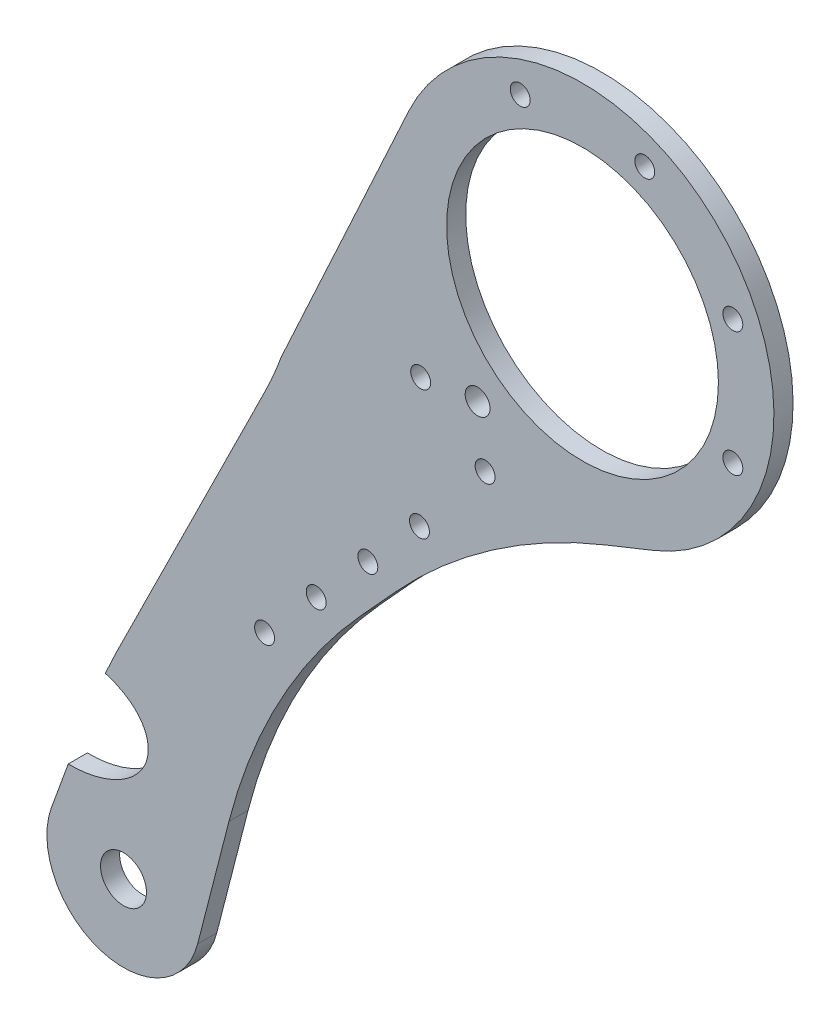
ISO-10303-21;
HEADER;
FILE_DESCRIPTION(('STEP AP214'),'2;1');
FILE_NAME('part.step','',(''),(''),'','','');
FILE_SCHEMA(('AUTOMOTIVE_DESIGN { 1 0 10303 214 1 1 1 1 }'));
ENDSEC;
DATA;
#1=APPLICATION_CONTEXT('core data for automotive mechanical design processes');
#2=APPLICATION_PROTOCOL_DEFINITION('international standard','automotive_design',2000,#1);
#3=PRODUCT_CONTEXT('',#1,'mechanical');
#4=PRODUCT('Part','Part','',(#3));
#5=PRODUCT_RELATED_PRODUCT_CATEGORY('part','',(#4));
#6=PRODUCT_DEFINITION_FORMATION('','',#4);
#7=PRODUCT_DEFINITION_CONTEXT('part definition',#1,'design');
#8=PRODUCT_DEFINITION('design','',#6,#7);
#9=PRODUCT_DEFINITION_SHAPE('','',#8);
#10=(LENGTH_UNIT() NAMED_UNIT(*) SI_UNIT(.MILLI.,.METRE.));
#11=(NAMED_UNIT(*) PLANE_ANGLE_UNIT() SI_UNIT($,.RADIAN.));
#12=(NAMED_UNIT(*) SI_UNIT($,.STERADIAN.) SOLID_ANGLE_UNIT());
#13=UNCERTAINTY_MEASURE_WITH_UNIT(LENGTH_MEASURE(1.E-05),#10,'distance_accuracy_value','');
#14=(GEOMETRIC_REPRESENTATION_CONTEXT(3) GLOBAL_UNCERTAINTY_ASSIGNED_CONTEXT((#13)) GLOBAL_UNIT_ASSIGNED_CONTEXT((#10,
#11,#12)) REPRESENTATION_CONTEXT('',''));
#15=CARTESIAN_POINT('',(0.,0.,0.));
#16=DIRECTION('',(0.,0.,1.));
#17=DIRECTION('',(1.,0.,0.));
#18=AXIS2_PLACEMENT_3D('',#15,#16,#17);
#19=CARTESIAN_POINT('',(-87.2473558230127,-77.9723044074539,5.));
#20=DIRECTION('',(0.,0.,1.));
#21=DIRECTION('',(1.,0.,0.));
#22=AXIS2_PLACEMENT_3D('',#19,#20,#21);
#23=PLANE('',#22);
#24=CARTESIAN_POINT('',(18.3767093876581,44.2943786461941,5.));
#25=DIRECTION('',(0.,0.,1.));
#26=DIRECTION('',(1.,0.,0.));
#27=AXIS2_PLACEMENT_3D('',#24,#25,#26);
#28=CIRCLE('',#27,3.25);
#29=CARTESIAN_POINT('',(21.6267093876581,44.2943786461941,5.));
#30=VERTEX_POINT('',#29);
#31=EDGE_CURVE('E182',#30,#30,#28,.T.);
#32=ORIENTED_EDGE('',*,*,#31,.F.);
#33=EDGE_LOOP('',(#32));
#34=FACE_BOUND('',#33,.T.);
#35=CARTESIAN_POINT('',(29.5069278175342,119.260159091029,5.));
#36=DIRECTION('',(0.,0.,1.));
#37=DIRECTION('',(1.,0.,0.));
#38=AXIS2_PLACEMENT_3D('',#35,#36,#37);
#39=CIRCLE('',#38,2.6);
#40=CARTESIAN_POINT('',(32.1069278175342,119.260159091029,5.));
#41=VERTEX_POINT('',#40);
#42=EDGE_CURVE('E194',#41,#41,#39,.T.);
#43=ORIENTED_EDGE('',*,*,#42,.F.);
#44=EDGE_LOOP('',(#43));
#45=FACE_BOUND('',#44,.T.);
#46=CARTESIAN_POINT('',(62.0350195685669,119.260159091029,5.));
#47=DIRECTION('',(0.,0.,1.));
#48=DIRECTION('',(1.,0.,0.));
#49=AXIS2_PLACEMENT_3D('',#46,#47,#48);
#50=CIRCLE('',#49,2.6);
#51=CARTESIAN_POINT('',(64.6350195685669,119.260159091029,5.));
#52=VERTEX_POINT('',#51);
#53=EDGE_CURVE('E200',#52,#52,#50,.T.);
#54=ORIENTED_EDGE('',*,*,#53,.F.);
#55=EDGE_LOOP('',(#54));
#56=FACE_BOUND('',#55,.T.);
#57=CARTESIAN_POINT('',(85.0358538247802,96.259324834816,5.));
#58=DIRECTION('',(0.,0.,1.));
#59=DIRECTION('',(1.,0.,0.));
#60=AXIS2_PLACEMENT_3D('',#57,#58,#59);
#61=CIRCLE('',#60,2.60000000000002);
#62=CARTESIAN_POINT('',(87.6358538247802,96.259324834816,5.));
#63=VERTEX_POINT('',#62);
#64=EDGE_CURVE('E206',#63,#63,#61,.T.);
#65=ORIENTED_EDGE('',*,*,#64,.F.);
#66=EDGE_LOOP('',(#65));
#67=FACE_BOUND('',#66,.T.);
#68=CARTESIAN_POINT('',(85.0358538247802,63.7312330837833,5.));
#69=DIRECTION('',(0.,0.,1.));
#70=DIRECTION('',(1.,0.,0.));
#71=AXIS2_PLACEMENT_3D('',#68,#69,#70);
#72=CIRCLE('',#71,2.6);
#73=CARTESIAN_POINT('',(87.6358538247802,63.7312330837833,5.));
#74=VERTEX_POINT('',#73);
#75=EDGE_CURVE('E187',#74,#74,#72,.T.);
#76=ORIENTED_EDGE('',*,*,#75,.F.);
#77=EDGE_LOOP('',(#76));
#78=FACE_BOUND('',#77,.T.);
#79=CARTESIAN_POINT('',(-23.7747681862979,-21.0648015144859,5.));
#80=DIRECTION('',(0.,0.,1.));
#81=DIRECTION('',(1.,0.,0.));
#82=AXIS2_PLACEMENT_3D('',#79,#80,#81);
#83=CIRCLE('',#82,2.6);
#84=CARTESIAN_POINT('',(-21.1747681862979,-21.0648015144859,5.));
#85=VERTEX_POINT('',#84);
#86=EDGE_CURVE('E220',#85,#85,#83,.T.);
#87=ORIENTED_EDGE('',*,*,#86,.F.);
#88=EDGE_LOOP('',(#87));
#89=FACE_BOUND('',#88,.T.);
#90=CARTESIAN_POINT('',(-37.2593092551394,-35.8352839765698,5.));
#91=DIRECTION('',(0.,0.,1.));
#92=DIRECTION('',(1.,0.,0.));
#93=AXIS2_PLACEMENT_3D('',#90,#91,#92);
#94=CIRCLE('',#93,2.6);
#95=CARTESIAN_POINT('',(-34.6593092551394,-35.8352839765698,5.));
#96=VERTEX_POINT('',#95);
#97=EDGE_CURVE('E232',#96,#96,#94,.T.);
#98=ORIENTED_EDGE('',*,*,#97,.F.);
#99=EDGE_LOOP('',(#98));
#100=FACE_BOUND('',#99,.T.);
#101=CARTESIAN_POINT('',(3.50503646705098,42.3364857628933,5.));
#102=DIRECTION('',(0.,0.,1.));
#103=DIRECTION('',(1.,0.,0.));
#104=AXIS2_PLACEMENT_3D('',#101,#102,#103);
#105=CIRCLE('',#104,2.6);
#106=CARTESIAN_POINT('',(6.10503646705098,42.3364857628933,5.));
#107=VERTEX_POINT('',#106);
#108=EDGE_CURVE('E238',#107,#107,#105,.T.);
#109=ORIENTED_EDGE('',*,*,#108,.F.);
#110=EDGE_LOOP('',(#109));
#111=FACE_BOUND('',#110,.T.);
#112=CARTESIAN_POINT('',(-74.1078932401975,-109.9952789593,5.));
#113=DIRECTION('',(0.,0.,1.));
#114=DIRECTION('',(1.,0.,0.));
#115=AXIS2_PLACEMENT_3D('',#112,#113,#114);
#116=CIRCLE('',#115,6.00000000000002);
#117=CARTESIAN_POINT('',(-68.1078932401974,-109.9952789593,5.));
#118=VERTEX_POINT('',#117);
#119=EDGE_CURVE('E250',#118,#118,#116,.T.);
#120=ORIENTED_EDGE('',*,*,#119,.F.);
#121=EDGE_LOOP('',(#120));
#122=FACE_BOUND('',#121,.T.);
#123=CARTESIAN_POINT('',(20.3346022709589,29.4227057255869,5.));
#124=DIRECTION('',(0.,0.,1.));
#125=DIRECTION('',(1.,0.,0.));
#126=AXIS2_PLACEMENT_3D('',#123,#124,#125);
#127=CIRCLE('',#126,2.6);
#128=CARTESIAN_POINT('',(22.9346022709589,29.4227057255869,5.));
#129=VERTEX_POINT('',#128);
#130=EDGE_CURVE('E244',#129,#129,#127,.T.);
#131=ORIENTED_EDGE('',*,*,#130,.F.);
#132=EDGE_LOOP('',(#131));
#133=FACE_BOUND('',#132,.T.);
#134=CARTESIAN_POINT('',(-10.2902271174564,-6.294319052402,5.));
#135=DIRECTION('',(0.,0.,1.));
#136=DIRECTION('',(1.,0.,0.));
#137=AXIS2_PLACEMENT_3D('',#134,#135,#136);
#138=CIRCLE('',#137,2.6);
#139=CARTESIAN_POINT('',(-7.69022711745644,-6.294319052402,5.));
#140=VERTEX_POINT('',#139);
#141=EDGE_CURVE('E226',#140,#140,#138,.T.);
#142=ORIENTED_EDGE('',*,*,#141,.F.);
#143=EDGE_LOOP('',(#142));
#144=FACE_BOUND('',#143,.T.);
#145=CARTESIAN_POINT('',(3.19431395138503,8.4761634096819,5.));
#146=DIRECTION('',(0.,0.,1.));
#147=DIRECTION('',(1.,0.,0.));
#148=AXIS2_PLACEMENT_3D('',#145,#146,#147);
#149=CIRCLE('',#148,2.6);
#150=CARTESIAN_POINT('',(5.79431395138502,8.4761634096819,5.));
#151=VERTEX_POINT('',#150);
#152=EDGE_CURVE('E214',#151,#151,#149,.T.);
#153=ORIENTED_EDGE('',*,*,#152,.F.);
#154=EDGE_LOOP('',(#153));
#155=FACE_BOUND('',#154,.T.);
#156=CARTESIAN_POINT('',(-74.1078932401975,-109.9952789593,5.));
#157=DIRECTION('',(0.,0.,1.));
#158=DIRECTION('',(1.,0.,0.));
#159=AXIS2_PLACEMENT_3D('',#156,#157,#158);
#160=CIRCLE('',#159,20.0000000000002);
#161=CARTESIAN_POINT('',(-92.9017456559157,-103.154876092786,5.));
#162=VERTEX_POINT('',#161);
#163=CARTESIAN_POINT('',(-54.7372550512299,-114.973067238457,5.));
#164=VERTEX_POINT('',#163);
#165=EDGE_CURVE('E345',#162,#164,#160,.T.);
#166=ORIENTED_EDGE('',*,*,#165,.T.);
#167=DIRECTION('',(-0.248889413957879,-0.968531909448369,0.));
#168=VECTOR('',#167,1.);
#169=CARTESIAN_POINT('',(-23.6314026287413,6.07270229704667,5.));
#170=LINE('',#169,#168);
#171=CARTESIAN_POINT('',(-46.5614675153302,-83.1576879201177,5.));
#172=VERTEX_POINT('',#171);
#173=EDGE_CURVE('E165',#172,#164,#170,.T.);
#174=ORIENTED_EDGE('',*,*,#173,.F.);
#175=CARTESIAN_POINT('',(98.7183189019252,-120.4911000138,5.));
#176=DIRECTION('',(0.,0.,1.));
#177=DIRECTION('',(1.,0.,0.));
#178=AXIS2_PLACEMENT_3D('',#175,#176,#177);
#179=CIRCLE('',#178,150.);
#180=CARTESIAN_POINT('',(-12.060299563704,-19.3570419974885,5.));
#181=VERTEX_POINT('',#180);
#182=EDGE_CURVE('E57',#172,#181,#179,.F.);
#183=ORIENTED_EDGE('',*,*,#182,.T.);
#184=DIRECTION('',(0.674227053442074,0.738524123104194,0.));
#185=VECTOR('',#184,1.);
#186=CARTESIAN_POINT('',(3.06060587253825,-2.79414472003352,5.));
#187=LINE('',#186,#185);
#188=CARTESIAN_POINT('',(-3.07570514297694,-9.51563963586652,5.));
#189=VERTEX_POINT('',#188);
#190=EDGE_CURVE('E171',#181,#189,#187,.T.);
#191=ORIENTED_EDGE('',*,*,#190,.T.);
#192=CARTESIAN_POINT('',(107.702913322652,-110.649697652178,5.));
#193=DIRECTION('',(0.,0.,1.));
#194=DIRECTION('',(1.,0.,0.));
#195=AXIS2_PLACEMENT_3D('',#192,#193,#194);
#196=CIRCLE('',#195,150.);
#197=CARTESIAN_POINT('',(51.8864623927853,28.5786177351522,5.));
#198=VERTEX_POINT('',#197);
#199=EDGE_CURVE('E170',#189,#198,#196,.F.);
#200=ORIENTED_EDGE('',*,*,#199,.T.);
#201=DIRECTION('',(-0.928188769248865,-0.37210967286578,0.));
#202=VECTOR('',#201,1.);
#203=CARTESIAN_POINT('',(-2.68622157797908,6.70049956291646,5.));
#204=LINE('',#203,#202);
#205=CARTESIAN_POINT('',(64.3764573363395,33.5858404968565,5.));
#206=VERTEX_POINT('',#205);
#207=EDGE_CURVE('E160',#206,#198,#204,.T.);
#208=ORIENTED_EDGE('',*,*,#207,.F.);
#209=CARTESIAN_POINT('',(45.7709736930505,79.9952789592997,5.));
#210=DIRECTION('',(0.,0.,1.));
#211=DIRECTION('',(1.,0.,0.));
#212=AXIS2_PLACEMENT_3D('',#209,#210,#211);
#213=CIRCLE('',#212,50.);
#214=CARTESIAN_POINT('',(0.358293308096093,100.916284199344,5.));
#215=VERTEX_POINT('',#214);
#216=EDGE_CURVE('E144',#206,#215,#213,.T.);
#217=ORIENTED_EDGE('',*,*,#216,.T.);
#218=DIRECTION('',(-0.418420104800895,-0.908253607699088,0.));
#219=VECTOR('',#218,1.);
#220=CARTESIAN_POINT('',(0.358293308096093,100.916284199344,5.));
#221=LINE('',#220,#219);
#222=CARTESIAN_POINT('',(-32.8546222168167,28.8218747730539,5.));
#223=VERTEX_POINT('',#222);
#224=EDGE_CURVE('E153',#215,#223,#221,.T.);
#225=ORIENTED_EDGE('',*,*,#224,.T.);
#226=CARTESIAN_POINT('',(-126.823884295407,63.0238891056213,5.));
#227=DIRECTION('',(0.,0.,-1.));
#228=DIRECTION('',(1.,0.,0.));
#229=AXIS2_PLACEMENT_3D('',#226,#227,#228);
#230=CIRCLE('',#229,100.);
#231=CARTESIAN_POINT('',(-37.2097827502313,18.6469491001312,5.));
#232=VERTEX_POINT('',#231);
#233=EDGE_CURVE('E257',#223,#232,#230,.T.);
#234=ORIENTED_EDGE('',*,*,#233,.T.);
#235=DIRECTION('',(-0.443769400054901,-0.896141015451761,0.));
#236=VECTOR('',#235,1.);
#237=CARTESIAN_POINT('',(-37.2097827502313,18.6469491001312,5.));
#238=LINE('',#237,#236);
#239=CARTESIAN_POINT('',(-75.1568945937203,-57.9828575892863,5.));
#240=VERTEX_POINT('',#239);
#241=EDGE_CURVE('E259',#232,#240,#238,.T.);
#242=ORIENTED_EDGE('',*,*,#241,.T.);
#243=CARTESIAN_POINT('',(104.071308496632,-146.736737600266,5.));
#244=DIRECTION('',(0.,0.,1.));
#245=DIRECTION('',(1.,0.,0.));
#246=AXIS2_PLACEMENT_3D('',#243,#244,#245);
#247=CIRCLE('',#246,200.);
#248=CARTESIAN_POINT('',(-78.8301753664011,-65.8229118304964,5.));
#249=VERTEX_POINT('',#248);
#250=EDGE_CURVE('E261',#240,#249,#247,.T.);
#251=ORIENTED_EDGE('',*,*,#250,.T.);
#252=CARTESIAN_POINT('',(-87.2473558230127,-77.9723044074539,5.));
#253=DIRECTION('',(0.,0.,-1.));
#254=DIRECTION('',(0.998564288915161,0.0535664158158636,0.));
#255=AXIS2_PLACEMENT_3D('',#252,#253,#254);
#256=ELLIPSE('',#255,19.6254544070607,13.1666159932936);
#257=CARTESIAN_POINT('',(-88.5355343691892,-91.158809173937,5.));
#258=VERTEX_POINT('',#257);
#259=EDGE_CURVE('E263',#249,#258,#256,.T.);
#260=ORIENTED_EDGE('',*,*,#259,.T.);
#261=DIRECTION('',(-0.342020143325669,-0.939692620785908,0.));
#262=VECTOR('',#261,1.);
#263=CARTESIAN_POINT('',(-88.5355343691892,-91.158809173937,5.));
#264=LINE('',#263,#262);
#265=EDGE_CURVE('E266',#258,#162,#264,.T.);
#266=ORIENTED_EDGE('',*,*,#265,.T.);
#267=EDGE_LOOP('',(#166,#174,#183,#191,#200,#208,#217,#225,#234,#242,#251,#260,#266));
#268=FACE_BOUND('',#267,.T.);
#269=CARTESIAN_POINT('',(45.7709736930505,79.9952789592997,5.));
#270=DIRECTION('',(0.,0.,1.));
#271=DIRECTION('',(1.,0.,0.));
#272=AXIS2_PLACEMENT_3D('',#269,#270,#271);
#273=CIRCLE('',#272,35.5);
#274=CARTESIAN_POINT('',(81.2709736930505,79.9952789592997,5.));
#275=VERTEX_POINT('',#274);
#276=EDGE_CURVE('E176',#275,#275,#273,.T.);
#277=ORIENTED_EDGE('',*,*,#276,.F.);
#278=EDGE_LOOP('',(#277));
#279=FACE_BOUND('',#278,.T.);
#280=ADVANCED_FACE('F49',(#34,#45,#56,#67,#78,#89,#100,#111,#122,#133,#144,#155,#268,#279),#23,.T.);
#281=CARTESIAN_POINT('',(-87.2473558230127,-77.9723044074539,0.));
#282=DIRECTION('',(0.,0.,1.));
#283=DIRECTION('',(1.,0.,0.));
#284=AXIS2_PLACEMENT_3D('',#281,#282,#283);
#285=PLANE('',#284);
#286=CARTESIAN_POINT('',(3.19431395138503,8.4761634096819,0.));
#287=DIRECTION('',(0.,0.,1.));
#288=DIRECTION('',(1.,0.,0.));
#289=AXIS2_PLACEMENT_3D('',#286,#287,#288);
#290=CIRCLE('',#289,2.6);
#291=CARTESIAN_POINT('',(5.79431395138502,8.4761634096819,0.));
#292=VERTEX_POINT('',#291);
#293=EDGE_CURVE('E193',#292,#292,#290,.T.);
#294=ORIENTED_EDGE('',*,*,#293,.T.);
#295=EDGE_LOOP('',(#294));
#296=FACE_BOUND('',#295,.T.);
#297=CARTESIAN_POINT('',(-23.7747681862979,-21.0648015144859,0.));
#298=DIRECTION('',(0.,0.,1.));
#299=DIRECTION('',(1.,0.,0.));
#300=AXIS2_PLACEMENT_3D('',#297,#298,#299);
#301=CIRCLE('',#300,2.6);
#302=CARTESIAN_POINT('',(-21.1747681862979,-21.0648015144859,0.));
#303=VERTEX_POINT('',#302);
#304=EDGE_CURVE('E217',#303,#303,#301,.T.);
#305=ORIENTED_EDGE('',*,*,#304,.T.);
#306=EDGE_LOOP('',(#305));
#307=FACE_BOUND('',#306,.T.);
#308=CARTESIAN_POINT('',(-10.2902271174564,-6.294319052402,0.));
#309=DIRECTION('',(0.,0.,1.));
#310=DIRECTION('',(1.,0.,0.));
#311=AXIS2_PLACEMENT_3D('',#308,#309,#310);
#312=CIRCLE('',#311,2.6);
#313=CARTESIAN_POINT('',(-7.69022711745644,-6.294319052402,0.));
#314=VERTEX_POINT('',#313);
#315=EDGE_CURVE('E223',#314,#314,#312,.T.);
#316=ORIENTED_EDGE('',*,*,#315,.T.);
#317=EDGE_LOOP('',(#316));
#318=FACE_BOUND('',#317,.T.);
#319=CARTESIAN_POINT('',(-37.2593092551394,-35.8352839765698,0.));
#320=DIRECTION('',(0.,0.,1.));
#321=DIRECTION('',(1.,0.,0.));
#322=AXIS2_PLACEMENT_3D('',#319,#320,#321);
#323=CIRCLE('',#322,2.6);
#324=CARTESIAN_POINT('',(-34.6593092551394,-35.8352839765698,0.));
#325=VERTEX_POINT('',#324);
#326=EDGE_CURVE('E229',#325,#325,#323,.T.);
#327=ORIENTED_EDGE('',*,*,#326,.T.);
#328=EDGE_LOOP('',(#327));
#329=FACE_BOUND('',#328,.T.);
#330=CARTESIAN_POINT('',(3.50503646705098,42.3364857628933,0.));
#331=DIRECTION('',(0.,0.,1.));
#332=DIRECTION('',(1.,0.,0.));
#333=AXIS2_PLACEMENT_3D('',#330,#331,#332);
#334=CIRCLE('',#333,2.6);
#335=CARTESIAN_POINT('',(6.10503646705098,42.3364857628933,0.));
#336=VERTEX_POINT('',#335);
#337=EDGE_CURVE('E235',#336,#336,#334,.T.);
#338=ORIENTED_EDGE('',*,*,#337,.T.);
#339=EDGE_LOOP('',(#338));
#340=FACE_BOUND('',#339,.T.);
#341=CARTESIAN_POINT('',(20.3346022709589,29.4227057255869,0.));
#342=DIRECTION('',(0.,0.,1.));
#343=DIRECTION('',(1.,0.,0.));
#344=AXIS2_PLACEMENT_3D('',#341,#342,#343);
#345=CIRCLE('',#344,2.6);
#346=CARTESIAN_POINT('',(22.9346022709589,29.4227057255869,0.));
#347=VERTEX_POINT('',#346);
#348=EDGE_CURVE('E241',#347,#347,#345,.T.);
#349=ORIENTED_EDGE('',*,*,#348,.T.);
#350=EDGE_LOOP('',(#349));
#351=FACE_BOUND('',#350,.T.);
#352=CARTESIAN_POINT('',(-74.1078932401975,-109.9952789593,0.));
#353=DIRECTION('',(0.,0.,1.));
#354=DIRECTION('',(1.,0.,0.));
#355=AXIS2_PLACEMENT_3D('',#352,#353,#354);
#356=CIRCLE('',#355,6.00000000000002);
#357=CARTESIAN_POINT('',(-68.1078932401974,-109.9952789593,0.));
#358=VERTEX_POINT('',#357);
#359=EDGE_CURVE('E247',#358,#358,#356,.T.);
#360=ORIENTED_EDGE('',*,*,#359,.T.);
#361=EDGE_LOOP('',(#360));
#362=FACE_BOUND('',#361,.T.);
#363=CARTESIAN_POINT('',(85.0358538247802,63.7312330837833,0.));
#364=DIRECTION('',(0.,0.,1.));
#365=DIRECTION('',(1.,0.,0.));
#366=AXIS2_PLACEMENT_3D('',#363,#364,#365);
#367=CIRCLE('',#366,2.6);
#368=CARTESIAN_POINT('',(87.6358538247802,63.7312330837833,0.));
#369=VERTEX_POINT('',#368);
#370=EDGE_CURVE('E209',#369,#369,#367,.T.);
#371=ORIENTED_EDGE('',*,*,#370,.T.);
#372=EDGE_LOOP('',(#371));
#373=FACE_BOUND('',#372,.T.);
#374=CARTESIAN_POINT('',(85.0358538247802,96.259324834816,0.));
#375=DIRECTION('',(0.,0.,1.));
#376=DIRECTION('',(1.,0.,0.));
#377=AXIS2_PLACEMENT_3D('',#374,#375,#376);
#378=CIRCLE('',#377,2.60000000000002);
#379=CARTESIAN_POINT('',(87.6358538247802,96.259324834816,0.));
#380=VERTEX_POINT('',#379);
#381=EDGE_CURVE('E203',#380,#380,#378,.T.);
#382=ORIENTED_EDGE('',*,*,#381,.T.);
#383=EDGE_LOOP('',(#382));
#384=FACE_BOUND('',#383,.T.);
#385=CARTESIAN_POINT('',(62.0350195685669,119.260159091029,0.));
#386=DIRECTION('',(0.,0.,1.));
#387=DIRECTION('',(1.,0.,0.));
#388=AXIS2_PLACEMENT_3D('',#385,#386,#387);
#389=CIRCLE('',#388,2.6);
#390=CARTESIAN_POINT('',(64.6350195685669,119.260159091029,0.));
#391=VERTEX_POINT('',#390);
#392=EDGE_CURVE('E197',#391,#391,#389,.T.);
#393=ORIENTED_EDGE('',*,*,#392,.T.);
#394=EDGE_LOOP('',(#393));
#395=FACE_BOUND('',#394,.T.);
#396=CARTESIAN_POINT('',(29.5069278175342,119.260159091029,0.));
#397=DIRECTION('',(0.,0.,1.));
#398=DIRECTION('',(1.,0.,0.));
#399=AXIS2_PLACEMENT_3D('',#396,#397,#398);
#400=CIRCLE('',#399,2.6);
#401=CARTESIAN_POINT('',(32.1069278175342,119.260159091029,0.));
#402=VERTEX_POINT('',#401);
#403=EDGE_CURVE('E190',#402,#402,#400,.T.);
#404=ORIENTED_EDGE('',*,*,#403,.T.);
#405=EDGE_LOOP('',(#404));
#406=FACE_BOUND('',#405,.T.);
#407=CARTESIAN_POINT('',(18.3767093876581,44.2943786461941,0.));
#408=DIRECTION('',(0.,0.,1.));
#409=DIRECTION('',(1.,0.,0.));
#410=AXIS2_PLACEMENT_3D('',#407,#408,#409);
#411=CIRCLE('',#410,3.25);
#412=CARTESIAN_POINT('',(21.6267093876581,44.2943786461941,0.));
#413=VERTEX_POINT('',#412);
#414=EDGE_CURVE('E184',#413,#413,#411,.T.);
#415=ORIENTED_EDGE('',*,*,#414,.T.);
#416=EDGE_LOOP('',(#415));
#417=FACE_BOUND('',#416,.T.);
#418=DIRECTION('',(0.674227053442074,0.738524123104194,0.));
#419=VECTOR('',#418,1.);
#420=CARTESIAN_POINT('',(-75.4254611049529,-88.7649664106359,0.));
#421=LINE('',#420,#419);
#422=CARTESIAN_POINT('',(-12.060299563704,-19.3570419974885,0.));
#423=VERTEX_POINT('',#422);
#424=CARTESIAN_POINT('',(-3.07570514297693,-9.51563963586652,0.));
#425=VERTEX_POINT('',#424);
#426=EDGE_CURVE('E378',#423,#425,#421,.T.);
#427=ORIENTED_EDGE('',*,*,#426,.F.);
#428=CARTESIAN_POINT('',(98.7183189019252,-120.4911000138,0.));
#429=DIRECTION('',(0.,0.,1.));
#430=DIRECTION('',(1.,0.,0.));
#431=AXIS2_PLACEMENT_3D('',#428,#429,#430);
#432=CIRCLE('',#431,150.);
#433=CARTESIAN_POINT('',(-46.5614675153302,-83.1576879201176,0.));
#434=VERTEX_POINT('',#433);
#435=EDGE_CURVE('E11',#423,#434,#432,.T.);
#436=ORIENTED_EDGE('',*,*,#435,.T.);
#437=DIRECTION('',(-0.24888941395788,-0.968531909448369,0.));
#438=VECTOR('',#437,1.);
#439=CARTESIAN_POINT('',(-47.8318183737261,-88.1011498495986,0.));
#440=LINE('',#439,#438);
#441=CARTESIAN_POINT('',(-54.7372550512299,-114.973067238457,0.));
#442=VERTEX_POINT('',#441);
#443=EDGE_CURVE('E342',#434,#442,#440,.T.);
#444=ORIENTED_EDGE('',*,*,#443,.T.);
#445=CARTESIAN_POINT('',(-74.1078932401975,-109.9952789593,0.));
#446=DIRECTION('',(0.,0.,1.));
#447=DIRECTION('',(1.,0.,0.));
#448=AXIS2_PLACEMENT_3D('',#445,#446,#447);
#449=CIRCLE('',#448,20.0000000000002);
#450=CARTESIAN_POINT('',(-92.9017456559157,-103.154876092786,0.));
#451=VERTEX_POINT('',#450);
#452=EDGE_CURVE('E154',#451,#442,#449,.T.);
#453=ORIENTED_EDGE('',*,*,#452,.F.);
#454=DIRECTION('',(-0.342020143325669,-0.939692620785908,0.));
#455=VECTOR('',#454,1.);
#456=CARTESIAN_POINT('',(-88.5355343691892,-91.158809173937,0.));
#457=LINE('',#456,#455);
#458=CARTESIAN_POINT('',(-88.5355343691892,-91.158809173937,0.));
#459=VERTEX_POINT('',#458);
#460=EDGE_CURVE('E338',#459,#451,#457,.T.);
#461=ORIENTED_EDGE('',*,*,#460,.F.);
#462=CARTESIAN_POINT('',(-87.2473558230127,-77.9723044074539,0.));
#463=DIRECTION('',(0.,0.,-1.));
#464=DIRECTION('',(0.998564288915161,0.0535664158158636,0.));
#465=AXIS2_PLACEMENT_3D('',#462,#463,#464);
#466=ELLIPSE('',#465,19.6254544070607,13.1666159932936);
#467=CARTESIAN_POINT('',(-78.8301753664011,-65.8229118304964,0.));
#468=VERTEX_POINT('',#467);
#469=EDGE_CURVE('E359',#468,#459,#466,.T.);
#470=ORIENTED_EDGE('',*,*,#469,.F.);
#471=CARTESIAN_POINT('',(104.071308496632,-146.736737600266,0.));
#472=DIRECTION('',(0.,0.,1.));
#473=DIRECTION('',(1.,0.,0.));
#474=AXIS2_PLACEMENT_3D('',#471,#472,#473);
#475=CIRCLE('',#474,200.);
#476=CARTESIAN_POINT('',(-75.1568945937203,-57.9828575892863,0.));
#477=VERTEX_POINT('',#476);
#478=EDGE_CURVE('E357',#477,#468,#475,.T.);
#479=ORIENTED_EDGE('',*,*,#478,.F.);
#480=DIRECTION('',(-0.443769400054901,-0.896141015451761,0.));
#481=VECTOR('',#480,1.);
#482=CARTESIAN_POINT('',(-37.2097827502313,18.6469491001312,0.));
#483=LINE('',#482,#481);
#484=CARTESIAN_POINT('',(-37.2097827502313,18.6469491001312,0.));
#485=VERTEX_POINT('',#484);
#486=EDGE_CURVE('E355',#485,#477,#483,.T.);
#487=ORIENTED_EDGE('',*,*,#486,.F.);
#488=CARTESIAN_POINT('',(-126.823884295407,63.0238891056213,0.));
#489=DIRECTION('',(0.,0.,-1.));
#490=DIRECTION('',(1.,0.,0.));
#491=AXIS2_PLACEMENT_3D('',#488,#489,#490);
#492=CIRCLE('',#491,100.);
#493=CARTESIAN_POINT('',(-32.8546222168167,28.8218747730539,0.));
#494=VERTEX_POINT('',#493);
#495=EDGE_CURVE('E353',#494,#485,#492,.T.);
#496=ORIENTED_EDGE('',*,*,#495,.F.);
#497=DIRECTION('',(-0.418420104800895,-0.908253607699088,0.));
#498=VECTOR('',#497,1.);
#499=CARTESIAN_POINT('',(0.358293308096093,100.916284199344,0.));
#500=LINE('',#499,#498);
#501=CARTESIAN_POINT('',(0.358293308096093,100.916284199344,0.));
#502=VERTEX_POINT('',#501);
#503=EDGE_CURVE('E351',#502,#494,#500,.T.);
#504=ORIENTED_EDGE('',*,*,#503,.F.);
#505=CARTESIAN_POINT('',(45.7709736930505,79.9952789592997,0.));
#506=DIRECTION('',(0.,0.,1.));
#507=DIRECTION('',(1.,0.,0.));
#508=AXIS2_PLACEMENT_3D('',#505,#506,#507);
#509=CIRCLE('',#508,50.);
#510=CARTESIAN_POINT('',(64.3764573363395,33.5858404968565,0.));
#511=VERTEX_POINT('',#510);
#512=EDGE_CURVE('E253',#511,#502,#509,.T.);
#513=ORIENTED_EDGE('',*,*,#512,.F.);
#514=DIRECTION('',(-0.928188769248865,-0.37210967286578,0.));
#515=VECTOR('',#514,1.);
#516=CARTESIAN_POINT('',(-104.783518952916,-34.2301744393261,0.));
#517=LINE('',#516,#515);
#518=CARTESIAN_POINT('',(51.8864623927853,28.5786177351522,0.));
#519=VERTEX_POINT('',#518);
#520=EDGE_CURVE('E163',#511,#519,#517,.T.);
#521=ORIENTED_EDGE('',*,*,#520,.T.);
#522=CARTESIAN_POINT('',(107.702913322652,-110.649697652178,0.));
#523=DIRECTION('',(0.,0.,1.));
#524=DIRECTION('',(1.,0.,0.));
#525=AXIS2_PLACEMENT_3D('',#522,#523,#524);
#526=CIRCLE('',#525,150.);
#527=EDGE_CURVE('E391',#519,#425,#526,.T.);
#528=ORIENTED_EDGE('',*,*,#527,.T.);
#529=EDGE_LOOP('',(#427,#436,#444,#453,#461,#470,#479,#487,#496,#504,#513,#521,#528));
#530=FACE_BOUND('',#529,.T.);
#531=CARTESIAN_POINT('',(45.7709736930505,79.9952789592997,0.));
#532=DIRECTION('',(0.,0.,1.));
#533=DIRECTION('',(1.,0.,0.));
#534=AXIS2_PLACEMENT_3D('',#531,#532,#533);
#535=CIRCLE('',#534,35.5);
#536=CARTESIAN_POINT('',(81.2709736930505,79.9952789592997,0.));
#537=VERTEX_POINT('',#536);
#538=EDGE_CURVE('E172',#537,#537,#535,.T.);
#539=ORIENTED_EDGE('',*,*,#538,.T.);
#540=EDGE_LOOP('',(#539));
#541=FACE_BOUND('',#540,.T.);
#542=ADVANCED_FACE('F293',(#296,#307,#318,#329,#340,#351,#362,#373,#384,#395,#406,#417,#530,
#541),#285,.F.);
#543=CARTESIAN_POINT('',(45.7709736930505,79.9952789592997,5.));
#544=DIRECTION('',(0.,0.,-1.));
#545=DIRECTION('',(-1.,0.,0.));
#546=AXIS2_PLACEMENT_3D('',#543,#544,#545);
#547=CYLINDRICAL_SURFACE('',#546,50.);
#548=ORIENTED_EDGE('',*,*,#512,.T.);
#549=DIRECTION('',(0.,0.,-1.));
#550=VECTOR('',#549,1.);
#551=CARTESIAN_POINT('',(0.358293308096093,100.916284199344,5.));
#552=LINE('',#551,#550);
#553=EDGE_CURVE('E150',#215,#502,#552,.T.);
#554=ORIENTED_EDGE('',*,*,#553,.F.);
#555=ORIENTED_EDGE('',*,*,#216,.F.);
#556=DIRECTION('',(0.,0.,1.));
#557=VECTOR('',#556,1.);
#558=CARTESIAN_POINT('',(64.3764573363395,33.5858404968565,-5.));
#559=LINE('',#558,#557);
#560=EDGE_CURVE('E148',#511,#206,#559,.T.);
#561=ORIENTED_EDGE('',*,*,#560,.F.);
#562=EDGE_LOOP('',(#548,#554,#555,#561));
#563=FACE_BOUND('',#562,.T.);
#564=ADVANCED_FACE('F147',(#563),#547,.T.);
#565=CARTESIAN_POINT('',(0.358293308096093,100.916284199344,5.));
#566=DIRECTION('',(0.908253607699088,-0.418420104800895,0.));
#567=DIRECTION('',(0.418420104800895,0.908253607699088,0.));
#568=AXIS2_PLACEMENT_3D('',#565,#566,#567);
#569=PLANE('',#568);
#570=ORIENTED_EDGE('',*,*,#503,.T.);
#571=DIRECTION('',(0.,0.,-1.));
#572=VECTOR('',#571,1.);
#573=CARTESIAN_POINT('',(-32.8546222168167,28.8218747730539,5.));
#574=LINE('',#573,#572);
#575=EDGE_CURVE('E373',#223,#494,#574,.T.);
#576=ORIENTED_EDGE('',*,*,#575,.F.);
#577=ORIENTED_EDGE('',*,*,#224,.F.);
#578=ORIENTED_EDGE('',*,*,#553,.T.);
#579=EDGE_LOOP('',(#570,#576,#577,#578));
#580=FACE_BOUND('',#579,.T.);
#581=ADVANCED_FACE('F287',(#580),#569,.F.);
#582=CARTESIAN_POINT('',(-126.823884295407,63.0238891056213,5.));
#583=DIRECTION('',(0.,0.,-1.));
#584=DIRECTION('',(-1.,0.,0.));
#585=AXIS2_PLACEMENT_3D('',#582,#583,#584);
#586=CYLINDRICAL_SURFACE('',#585,100.);
#587=ORIENTED_EDGE('',*,*,#495,.T.);
#588=DIRECTION('',(0.,0.,-1.));
#589=VECTOR('',#588,1.);
#590=CARTESIAN_POINT('',(-37.2097827502313,18.6469491001312,5.));
#591=LINE('',#590,#589);
#592=EDGE_CURVE('E370',#232,#485,#591,.T.);
#593=ORIENTED_EDGE('',*,*,#592,.F.);
#594=ORIENTED_EDGE('',*,*,#233,.F.);
#595=ORIENTED_EDGE('',*,*,#575,.T.);
#596=EDGE_LOOP('',(#587,#593,#594,#595));
#597=FACE_BOUND('',#596,.T.);
#598=ADVANCED_FACE('F283',(#597),#586,.F.);
#599=CARTESIAN_POINT('',(-37.2097827502313,18.6469491001312,5.));
#600=DIRECTION('',(0.896141015451761,-0.443769400054901,0.));
#601=DIRECTION('',(0.443769400054901,0.896141015451761,0.));
#602=AXIS2_PLACEMENT_3D('',#599,#600,#601);
#603=PLANE('',#602);
#604=ORIENTED_EDGE('',*,*,#486,.T.);
#605=DIRECTION('',(0.,0.,-1.));
#606=VECTOR('',#605,1.);
#607=CARTESIAN_POINT('',(-75.1568945937203,-57.9828575892863,5.));
#608=LINE('',#607,#606);
#609=EDGE_CURVE('E367',#240,#477,#608,.T.);
#610=ORIENTED_EDGE('',*,*,#609,.F.);
#611=ORIENTED_EDGE('',*,*,#241,.F.);
#612=ORIENTED_EDGE('',*,*,#592,.T.);
#613=EDGE_LOOP('',(#604,#610,#611,#612));
#614=FACE_BOUND('',#613,.T.);
#615=ADVANCED_FACE('F279',(#614),#603,.F.);
#616=CARTESIAN_POINT('',(104.071308496632,-146.736737600266,5.));
#617=DIRECTION('',(0.,0.,-1.));
#618=DIRECTION('',(-1.,0.,0.));
#619=AXIS2_PLACEMENT_3D('',#616,#617,#618);
#620=CYLINDRICAL_SURFACE('',#619,200.);
#621=ORIENTED_EDGE('',*,*,#478,.T.);
#622=DIRECTION('',(0.,0.,-1.));
#623=VECTOR('',#622,1.);
#624=CARTESIAN_POINT('',(-78.8301753664011,-65.8229118304964,5.));
#625=LINE('',#624,#623);
#626=EDGE_CURVE('E364',#249,#468,#625,.T.);
#627=ORIENTED_EDGE('',*,*,#626,.F.);
#628=ORIENTED_EDGE('',*,*,#250,.F.);
#629=ORIENTED_EDGE('',*,*,#609,.T.);
#630=EDGE_LOOP('',(#621,#627,#628,#629));
#631=FACE_BOUND('',#630,.T.);
#632=ADVANCED_FACE('F274',(#631),#620,.T.);
#633=DIRECTION('',(0.,0.,-1.));
#634=VECTOR('',#633,1.);
#635=SURFACE_OF_LINEAR_EXTRUSION('',#256,#634);
#636=ORIENTED_EDGE('',*,*,#469,.T.);
#637=DIRECTION('',(0.,0.,-1.));
#638=VECTOR('',#637,1.);
#639=CARTESIAN_POINT('',(-88.5355343691892,-91.158809173937,5.));
#640=LINE('',#639,#638);
#641=EDGE_CURVE('E347',#258,#459,#640,.T.);
#642=ORIENTED_EDGE('',*,*,#641,.F.);
#643=ORIENTED_EDGE('',*,*,#259,.F.);
#644=ORIENTED_EDGE('',*,*,#626,.T.);
#645=EDGE_LOOP('',(#636,#642,#643,#644));
#646=FACE_BOUND('',#645,.T.);
#647=ADVANCED_FACE('F269',(#646),#635,.F.);
#648=CARTESIAN_POINT('',(-88.5355343691892,-91.158809173937,5.));
#649=DIRECTION('',(0.939692620785908,-0.342020143325669,0.));
#650=DIRECTION('',(0.342020143325669,0.939692620785909,0.));
#651=AXIS2_PLACEMENT_3D('',#648,#649,#650);
#652=PLANE('',#651);
#653=ORIENTED_EDGE('',*,*,#460,.T.);
#654=DIRECTION('',(0.,0.,-1.));
#655=VECTOR('',#654,1.);
#656=CARTESIAN_POINT('',(-92.9017456559157,-103.154876092786,5.));
#657=LINE('',#656,#655);
#658=EDGE_CURVE('E336',#162,#451,#657,.T.);
#659=ORIENTED_EDGE('',*,*,#658,.F.);
#660=ORIENTED_EDGE('',*,*,#265,.F.);
#661=ORIENTED_EDGE('',*,*,#641,.T.);
#662=EDGE_LOOP('',(#653,#659,#660,#661));
#663=FACE_BOUND('',#662,.T.);
#664=ADVANCED_FACE('F273',(#663),#652,.F.);
#665=CARTESIAN_POINT('',(-74.1078932401975,-109.9952789593,5.));
#666=DIRECTION('',(0.,0.,-1.));
#667=DIRECTION('',(-1.,0.,0.));
#668=AXIS2_PLACEMENT_3D('',#665,#666,#667);
#669=CYLINDRICAL_SURFACE('',#668,20.0000000000002);
#670=ORIENTED_EDGE('',*,*,#452,.T.);
#671=DIRECTION('',(0.,0.,1.));
#672=VECTOR('',#671,1.);
#673=CARTESIAN_POINT('',(-54.7372550512299,-114.973067238457,-5.));
#674=LINE('',#673,#672);
#675=EDGE_CURVE('E164',#442,#164,#674,.T.);
#676=ORIENTED_EDGE('',*,*,#675,.T.);
#677=ORIENTED_EDGE('',*,*,#165,.F.);
#678=ORIENTED_EDGE('',*,*,#658,.T.);
#679=EDGE_LOOP('',(#670,#676,#677,#678));
#680=FACE_BOUND('',#679,.T.);
#681=ADVANCED_FACE('F319',(#680),#669,.T.);
#682=CARTESIAN_POINT('',(-74.1078932401975,-109.9952789593,5.));
#683=DIRECTION('',(0.,0.,-1.));
#684=DIRECTION('',(-1.,0.,0.));
#685=AXIS2_PLACEMENT_3D('',#682,#683,#684);
#686=CYLINDRICAL_SURFACE('',#685,6.00000000000002);
#687=ORIENTED_EDGE('',*,*,#119,.T.);
#688=EDGE_LOOP('',(#687));
#689=FACE_BOUND('',#688,.T.);
#690=ORIENTED_EDGE('',*,*,#359,.F.);
#691=EDGE_LOOP('',(#690));
#692=FACE_BOUND('',#691,.T.);
#693=ADVANCED_FACE('F317',(#689,#692),#686,.F.);
#694=CARTESIAN_POINT('',(20.3346022709589,29.4227057255869,5.));
#695=DIRECTION('',(0.,0.,-1.));
#696=DIRECTION('',(-1.,0.,0.));
#697=AXIS2_PLACEMENT_3D('',#694,#695,#696);
#698=CYLINDRICAL_SURFACE('',#697,2.6);
#699=ORIENTED_EDGE('',*,*,#130,.T.);
#700=EDGE_LOOP('',(#699));
#701=FACE_BOUND('',#700,.T.);
#702=ORIENTED_EDGE('',*,*,#348,.F.);
#703=EDGE_LOOP('',(#702));
#704=FACE_BOUND('',#703,.T.);
#705=ADVANCED_FACE('F326',(#701,#704),#698,.F.);
#706=CARTESIAN_POINT('',(3.50503646705098,42.3364857628933,5.));
#707=DIRECTION('',(0.,0.,-1.));
#708=DIRECTION('',(-1.,0.,0.));
#709=AXIS2_PLACEMENT_3D('',#706,#707,#708);
#710=CYLINDRICAL_SURFACE('',#709,2.6);
#711=ORIENTED_EDGE('',*,*,#108,.T.);
#712=EDGE_LOOP('',(#711));
#713=FACE_BOUND('',#712,.T.);
#714=ORIENTED_EDGE('',*,*,#337,.F.);
#715=EDGE_LOOP('',(#714));
#716=FACE_BOUND('',#715,.T.);
#717=ADVANCED_FACE('F456',(#713,#716),#710,.F.);
#718=CARTESIAN_POINT('',(-37.2593092551394,-35.8352839765698,5.));
#719=DIRECTION('',(0.,0.,-1.));
#720=DIRECTION('',(-1.,0.,0.));
#721=AXIS2_PLACEMENT_3D('',#718,#719,#720);
#722=CYLINDRICAL_SURFACE('',#721,2.6);
#723=ORIENTED_EDGE('',*,*,#97,.T.);
#724=EDGE_LOOP('',(#723));
#725=FACE_BOUND('',#724,.T.);
#726=ORIENTED_EDGE('',*,*,#326,.F.);
#727=EDGE_LOOP('',(#726));
#728=FACE_BOUND('',#727,.T.);
#729=ADVANCED_FACE('F452',(#725,#728),#722,.F.);
#730=CARTESIAN_POINT('',(-10.2902271174564,-6.294319052402,5.));
#731=DIRECTION('',(0.,0.,-1.));
#732=DIRECTION('',(-1.,0.,0.));
#733=AXIS2_PLACEMENT_3D('',#730,#731,#732);
#734=CYLINDRICAL_SURFACE('',#733,2.6);
#735=ORIENTED_EDGE('',*,*,#141,.T.);
#736=EDGE_LOOP('',(#735));
#737=FACE_BOUND('',#736,.T.);
#738=ORIENTED_EDGE('',*,*,#315,.F.);
#739=EDGE_LOOP('',(#738));
#740=FACE_BOUND('',#739,.T.);
#741=ADVANCED_FACE('F448',(#737,#740),#734,.F.);
#742=CARTESIAN_POINT('',(-23.7747681862979,-21.0648015144859,5.));
#743=DIRECTION('',(0.,0.,-1.));
#744=DIRECTION('',(-1.,0.,0.));
#745=AXIS2_PLACEMENT_3D('',#742,#743,#744);
#746=CYLINDRICAL_SURFACE('',#745,2.6);
#747=ORIENTED_EDGE('',*,*,#86,.T.);
#748=EDGE_LOOP('',(#747));
#749=FACE_BOUND('',#748,.T.);
#750=ORIENTED_EDGE('',*,*,#304,.F.);
#751=EDGE_LOOP('',(#750));
#752=FACE_BOUND('',#751,.T.);
#753=ADVANCED_FACE('F444',(#749,#752),#746,.F.);
#754=CARTESIAN_POINT('',(3.19431395138503,8.4761634096819,5.));
#755=DIRECTION('',(0.,0.,-1.));
#756=DIRECTION('',(-1.,0.,0.));
#757=AXIS2_PLACEMENT_3D('',#754,#755,#756);
#758=CYLINDRICAL_SURFACE('',#757,2.6);
#759=ORIENTED_EDGE('',*,*,#152,.T.);
#760=EDGE_LOOP('',(#759));
#761=FACE_BOUND('',#760,.T.);
#762=ORIENTED_EDGE('',*,*,#293,.F.);
#763=EDGE_LOOP('',(#762));
#764=FACE_BOUND('',#763,.T.);
#765=ADVANCED_FACE('F440',(#761,#764),#758,.F.);
#766=CARTESIAN_POINT('',(85.0358538247802,63.7312330837833,0.));
#767=DIRECTION('',(0.,0.,1.));
#768=DIRECTION('',(1.,0.,0.));
#769=AXIS2_PLACEMENT_3D('',#766,#767,#768);
#770=CYLINDRICAL_SURFACE('',#769,2.6);
#771=ORIENTED_EDGE('',*,*,#370,.F.);
#772=EDGE_LOOP('',(#771));
#773=FACE_BOUND('',#772,.T.);
#774=ORIENTED_EDGE('',*,*,#75,.T.);
#775=EDGE_LOOP('',(#774));
#776=FACE_BOUND('',#775,.T.);
#777=ADVANCED_FACE('F436',(#773,#776),#770,.F.);
#778=CARTESIAN_POINT('',(85.0358538247802,96.259324834816,0.));
#779=DIRECTION('',(0.,0.,1.));
#780=DIRECTION('',(1.,0.,0.));
#781=AXIS2_PLACEMENT_3D('',#778,#779,#780);
#782=CYLINDRICAL_SURFACE('',#781,2.60000000000002);
#783=ORIENTED_EDGE('',*,*,#381,.F.);
#784=EDGE_LOOP('',(#783));
#785=FACE_BOUND('',#784,.T.);
#786=ORIENTED_EDGE('',*,*,#64,.T.);
#787=EDGE_LOOP('',(#786));
#788=FACE_BOUND('',#787,.T.);
#789=ADVANCED_FACE('F432',(#785,#788),#782,.F.);
#790=CARTESIAN_POINT('',(62.0350195685669,119.260159091029,0.));
#791=DIRECTION('',(0.,0.,1.));
#792=DIRECTION('',(1.,0.,0.));
#793=AXIS2_PLACEMENT_3D('',#790,#791,#792);
#794=CYLINDRICAL_SURFACE('',#793,2.6);
#795=ORIENTED_EDGE('',*,*,#392,.F.);
#796=EDGE_LOOP('',(#795));
#797=FACE_BOUND('',#796,.T.);
#798=ORIENTED_EDGE('',*,*,#53,.T.);
#799=EDGE_LOOP('',(#798));
#800=FACE_BOUND('',#799,.T.);
#801=ADVANCED_FACE('F428',(#797,#800),#794,.F.);
#802=CARTESIAN_POINT('',(29.5069278175342,119.260159091029,0.));
#803=DIRECTION('',(0.,0.,1.));
#804=DIRECTION('',(1.,0.,0.));
#805=AXIS2_PLACEMENT_3D('',#802,#803,#804);
#806=CYLINDRICAL_SURFACE('',#805,2.6);
#807=ORIENTED_EDGE('',*,*,#403,.F.);
#808=EDGE_LOOP('',(#807));
#809=FACE_BOUND('',#808,.T.);
#810=ORIENTED_EDGE('',*,*,#42,.T.);
#811=EDGE_LOOP('',(#810));
#812=FACE_BOUND('',#811,.T.);
#813=ADVANCED_FACE('F424',(#809,#812),#806,.F.);
#814=CARTESIAN_POINT('',(18.3767093876581,44.2943786461941,0.));
#815=DIRECTION('',(0.,0.,1.));
#816=DIRECTION('',(1.,0.,0.));
#817=AXIS2_PLACEMENT_3D('',#814,#815,#816);
#818=CYLINDRICAL_SURFACE('',#817,3.25);
#819=ORIENTED_EDGE('',*,*,#414,.F.);
#820=EDGE_LOOP('',(#819));
#821=FACE_BOUND('',#820,.T.);
#822=ORIENTED_EDGE('',*,*,#31,.T.);
#823=EDGE_LOOP('',(#822));
#824=FACE_BOUND('',#823,.T.);
#825=ADVANCED_FACE('F420',(#821,#824),#818,.F.);
#826=CARTESIAN_POINT('',(-23.6314026287413,6.07270229704667,-5.));
#827=DIRECTION('',(-0.968531909448369,0.24888941395788,0.));
#828=DIRECTION('',(-0.24888941395788,-0.968531909448369,0.));
#829=AXIS2_PLACEMENT_3D('',#826,#827,#828);
#830=PLANE('',#829);
#831=ORIENTED_EDGE('',*,*,#443,.F.);
#832=DIRECTION('',(0.,0.,1.));
#833=VECTOR('',#832,1.);
#834=CARTESIAN_POINT('',(-46.5614675153302,-83.1576879201176,-5.));
#835=LINE('',#834,#833);
#836=EDGE_CURVE('E344',#434,#172,#835,.T.);
#837=ORIENTED_EDGE('',*,*,#836,.T.);
#838=ORIENTED_EDGE('',*,*,#173,.T.);
#839=ORIENTED_EDGE('',*,*,#675,.F.);
#840=EDGE_LOOP('',(#831,#837,#838,#839));
#841=FACE_BOUND('',#840,.T.);
#842=ADVANCED_FACE('F341',(#841),#830,.F.);
#843=CARTESIAN_POINT('',(3.06060587253825,-2.79414472003352,-5.));
#844=DIRECTION('',(0.738524123104194,-0.674227053442074,0.));
#845=DIRECTION('',(0.674227053442074,0.738524123104194,0.));
#846=AXIS2_PLACEMENT_3D('',#843,#844,#845);
#847=PLANE('',#846);
#848=ORIENTED_EDGE('',*,*,#426,.T.);
#849=DIRECTION('',(0.,0.,1.));
#850=VECTOR('',#849,1.);
#851=CARTESIAN_POINT('',(-3.07570514297693,-9.51563963586652,-5.));
#852=LINE('',#851,#850);
#853=EDGE_CURVE('E384',#425,#189,#852,.T.);
#854=ORIENTED_EDGE('',*,*,#853,.T.);
#855=ORIENTED_EDGE('',*,*,#190,.F.);
#856=DIRECTION('',(0.,0.,1.));
#857=VECTOR('',#856,1.);
#858=CARTESIAN_POINT('',(-12.060299563704,-19.3570419974885,-5.));
#859=LINE('',#858,#857);
#860=EDGE_CURVE('E382',#181,#423,#859,.F.);
#861=ORIENTED_EDGE('',*,*,#860,.T.);
#862=EDGE_LOOP('',(#848,#854,#855,#861));
#863=FACE_BOUND('',#862,.T.);
#864=ADVANCED_FACE('F302',(#863),#847,.T.);
#865=CARTESIAN_POINT('',(-2.68622157797908,6.70049956291646,-5.));
#866=DIRECTION('',(-0.37210967286578,0.928188769248865,0.));
#867=DIRECTION('',(-0.928188769248865,-0.37210967286578,0.));
#868=AXIS2_PLACEMENT_3D('',#865,#866,#867);
#869=PLANE('',#868);
#870=ORIENTED_EDGE('',*,*,#207,.T.);
#871=DIRECTION('',(0.,0.,1.));
#872=VECTOR('',#871,1.);
#873=CARTESIAN_POINT('',(51.8864623927853,28.5786177351522,-5.));
#874=LINE('',#873,#872);
#875=EDGE_CURVE('E387',#198,#519,#874,.F.);
#876=ORIENTED_EDGE('',*,*,#875,.T.);
#877=ORIENTED_EDGE('',*,*,#520,.F.);
#878=ORIENTED_EDGE('',*,*,#560,.T.);
#879=EDGE_LOOP('',(#870,#876,#877,#878));
#880=FACE_BOUND('',#879,.T.);
#881=ADVANCED_FACE('F159',(#880),#869,.F.);
#882=CARTESIAN_POINT('',(107.702913322652,-110.649697652178,-5.));
#883=DIRECTION('',(0.,0.,1.));
#884=DIRECTION('',(1.,0.,0.));
#885=AXIS2_PLACEMENT_3D('',#882,#883,#884);
#886=CYLINDRICAL_SURFACE('',#885,150.);
#887=ORIENTED_EDGE('',*,*,#527,.F.);
#888=ORIENTED_EDGE('',*,*,#875,.F.);
#889=ORIENTED_EDGE('',*,*,#199,.F.);
#890=ORIENTED_EDGE('',*,*,#853,.F.);
#891=EDGE_LOOP('',(#887,#888,#889,#890));
#892=FACE_BOUND('',#891,.T.);
#893=ADVANCED_FACE('F294',(#892),#886,.F.);
#894=CARTESIAN_POINT('',(98.7183189019252,-120.4911000138,-5.));
#895=DIRECTION('',(0.,0.,1.));
#896=DIRECTION('',(1.,0.,0.));
#897=AXIS2_PLACEMENT_3D('',#894,#895,#896);
#898=CYLINDRICAL_SURFACE('',#897,150.);
#899=ORIENTED_EDGE('',*,*,#435,.F.);
#900=ORIENTED_EDGE('',*,*,#860,.F.);
#901=ORIENTED_EDGE('',*,*,#182,.F.);
#902=ORIENTED_EDGE('',*,*,#836,.F.);
#903=EDGE_LOOP('',(#899,#900,#901,#902));
#904=FACE_BOUND('',#903,.T.);
#905=ADVANCED_FACE('F51',(#904),#898,.F.);
#906=CARTESIAN_POINT('',(45.7709736930505,79.9952789592997,0.));
#907=DIRECTION('',(0.,0.,1.));
#908=DIRECTION('',(1.,0.,0.));
#909=AXIS2_PLACEMENT_3D('',#906,#907,#908);
#910=CYLINDRICAL_SURFACE('',#909,35.5);
#911=ORIENTED_EDGE('',*,*,#538,.F.);
#912=EDGE_LOOP('',(#911));
#913=FACE_BOUND('',#912,.T.);
#914=ORIENTED_EDGE('',*,*,#276,.T.);
#915=EDGE_LOOP('',(#914));
#916=FACE_BOUND('',#915,.T.);
#917=ADVANCED_FACE('F301',(#913,#916),#910,.F.);
#918=CLOSED_SHELL('',(#280,#542,#564,#581,#598,#615,#632,#647,#664,#681,#693,#705,#717,#729,
#741,#753,#765,#777,#789,#801,#813,#825,#842,#864,#881,#893,#905,#917));
#919=MANIFOLD_SOLID_BREP('B2',#918);
#920=ADVANCED_BREP_SHAPE_REPRESENTATION('',(#18,#919),#14);
#921=SHAPE_DEFINITION_REPRESENTATION(#9,#920);
ENDSEC;
END-ISO-10303-21;
